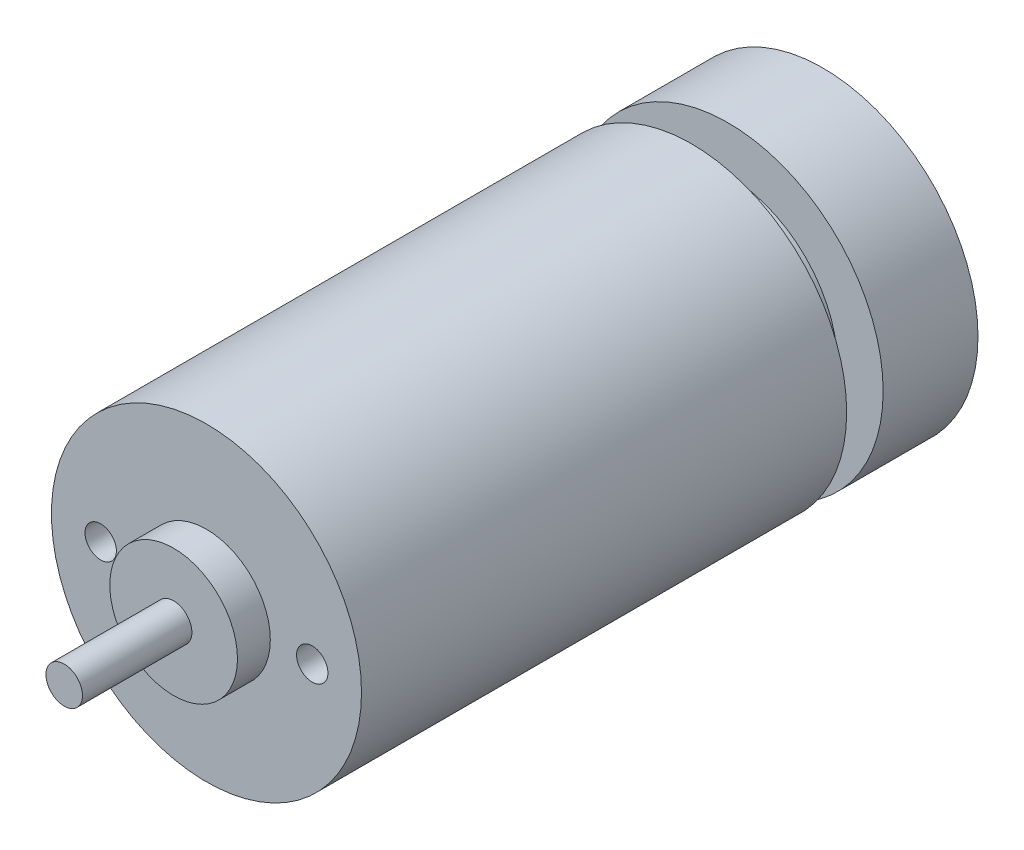
ISO-10303-21;
HEADER;
FILE_DESCRIPTION(('STEP AP214'),'2;1');
FILE_NAME('part.step','',(''),(''),'','','');
FILE_SCHEMA(('AUTOMOTIVE_DESIGN { 1 0 10303 214 1 1 1 1 }'));
ENDSEC;
DATA;
#1=APPLICATION_CONTEXT('core data for automotive mechanical design processes');
#2=APPLICATION_PROTOCOL_DEFINITION('international standard','automotive_design',2000,#1);
#3=PRODUCT_CONTEXT('',#1,'mechanical');
#4=PRODUCT('Part','Part','',(#3));
#5=PRODUCT_RELATED_PRODUCT_CATEGORY('part','',(#4));
#6=PRODUCT_DEFINITION_FORMATION('','',#4);
#7=PRODUCT_DEFINITION_CONTEXT('part definition',#1,'design');
#8=PRODUCT_DEFINITION('design','',#6,#7);
#9=PRODUCT_DEFINITION_SHAPE('','',#8);
#10=(LENGTH_UNIT() NAMED_UNIT(*) SI_UNIT(.MILLI.,.METRE.));
#11=(NAMED_UNIT(*) PLANE_ANGLE_UNIT() SI_UNIT($,.RADIAN.));
#12=(NAMED_UNIT(*) SI_UNIT($,.STERADIAN.) SOLID_ANGLE_UNIT());
#13=UNCERTAINTY_MEASURE_WITH_UNIT(LENGTH_MEASURE(1.E-05),#10,'distance_accuracy_value','');
#14=(GEOMETRIC_REPRESENTATION_CONTEXT(3) GLOBAL_UNCERTAINTY_ASSIGNED_CONTEXT((#13)) GLOBAL_UNIT_ASSIGNED_CONTEXT((#10,
#11,#12)) REPRESENTATION_CONTEXT('',''));
#15=CARTESIAN_POINT('',(0.,0.,0.));
#16=DIRECTION('',(0.,0.,1.));
#17=DIRECTION('',(1.,0.,0.));
#18=AXIS2_PLACEMENT_3D('',#15,#16,#17);
#19=CARTESIAN_POINT('',(0.,0.,66.5));
#20=DIRECTION('',(0.,0.,-1.));
#21=DIRECTION('',(-1.,0.,0.));
#22=AXIS2_PLACEMENT_3D('',#19,#20,#21);
#23=CYLINDRICAL_SURFACE('',#22,21.25);
#24=CARTESIAN_POINT('',(0.,0.,66.5));
#25=DIRECTION('',(0.,0.,1.));
#26=DIRECTION('',(1.,0.,0.));
#27=AXIS2_PLACEMENT_3D('',#24,#25,#26);
#28=CIRCLE('',#27,21.25);
#29=CARTESIAN_POINT('',(21.25,0.,66.5));
#30=VERTEX_POINT('',#29);
#31=EDGE_CURVE('E83',#30,#30,#28,.T.);
#32=ORIENTED_EDGE('',*,*,#31,.F.);
#33=EDGE_LOOP('',(#32));
#34=FACE_BOUND('',#33,.T.);
#35=CARTESIAN_POINT('',(0.,0.,0.));
#36=DIRECTION('',(0.,0.,1.));
#37=DIRECTION('',(1.,0.,0.));
#38=AXIS2_PLACEMENT_3D('',#35,#36,#37);
#39=CIRCLE('',#38,21.25);
#40=CARTESIAN_POINT('',(21.25,0.,0.));
#41=VERTEX_POINT('',#40);
#42=EDGE_CURVE('E40',#41,#41,#39,.T.);
#43=ORIENTED_EDGE('',*,*,#42,.T.);
#44=EDGE_LOOP('',(#43));
#45=FACE_BOUND('',#44,.T.);
#46=ADVANCED_FACE('F37',(#34,#45),#23,.T.);
#47=CARTESIAN_POINT('',(0.,0.,66.5));
#48=DIRECTION('',(0.,0.,1.));
#49=DIRECTION('',(1.,0.,0.));
#50=AXIS2_PLACEMENT_3D('',#47,#48,#49);
#51=PLANE('',#50);
#52=CARTESIAN_POINT('',(-14.5,0.,66.5));
#53=DIRECTION('',(0.,0.,1.));
#54=DIRECTION('',(1.,0.,0.));
#55=AXIS2_PLACEMENT_3D('',#52,#53,#54);
#56=CIRCLE('',#55,2.15);
#57=CARTESIAN_POINT('',(-12.35,0.,66.5));
#58=VERTEX_POINT('',#57);
#59=EDGE_CURVE('E62',#58,#58,#56,.T.);
#60=ORIENTED_EDGE('',*,*,#59,.F.);
#61=EDGE_LOOP('',(#60));
#62=FACE_BOUND('',#61,.T.);
#63=CARTESIAN_POINT('',(14.5,0.,66.5));
#64=DIRECTION('',(0.,0.,1.));
#65=DIRECTION('',(1.,0.,0.));
#66=AXIS2_PLACEMENT_3D('',#63,#64,#65);
#67=CIRCLE('',#66,2.15);
#68=CARTESIAN_POINT('',(16.65,0.,66.5));
#69=VERTEX_POINT('',#68);
#70=EDGE_CURVE('E70',#69,#69,#67,.T.);
#71=ORIENTED_EDGE('',*,*,#70,.F.);
#72=EDGE_LOOP('',(#71));
#73=FACE_BOUND('',#72,.T.);
#74=CARTESIAN_POINT('',(0.,0.,66.5));
#75=DIRECTION('',(0.,0.,1.));
#76=DIRECTION('',(1.,0.,0.));
#77=AXIS2_PLACEMENT_3D('',#74,#75,#76);
#78=CIRCLE('',#77,8.75);
#79=CARTESIAN_POINT('',(8.75,0.,66.5));
#80=VERTEX_POINT('',#79);
#81=EDGE_CURVE('E51',#80,#80,#78,.T.);
#82=ORIENTED_EDGE('',*,*,#81,.F.);
#83=EDGE_LOOP('',(#82));
#84=FACE_BOUND('',#83,.T.);
#85=ORIENTED_EDGE('',*,*,#31,.T.);
#86=EDGE_LOOP('',(#85));
#87=FACE_BOUND('',#86,.T.);
#88=ADVANCED_FACE('F96',(#62,#73,#84,#87),#51,.T.);
#89=CARTESIAN_POINT('',(0.,0.,0.));
#90=DIRECTION('',(0.,0.,1.));
#91=DIRECTION('',(1.,0.,0.));
#92=AXIS2_PLACEMENT_3D('',#89,#90,#91);
#93=PLANE('',#92);
#94=CARTESIAN_POINT('',(0.,0.,0.));
#95=DIRECTION('',(0.,0.,-1.));
#96=DIRECTION('',(-1.,0.,0.));
#97=AXIS2_PLACEMENT_3D('',#94,#95,#96);
#98=CIRCLE('',#97,15.);
#99=CARTESIAN_POINT('',(-15.,0.,0.));
#100=VERTEX_POINT('',#99);
#101=EDGE_CURVE('E10',#100,#100,#98,.T.);
#102=ORIENTED_EDGE('',*,*,#101,.F.);
#103=EDGE_LOOP('',(#102));
#104=FACE_BOUND('',#103,.T.);
#105=ORIENTED_EDGE('',*,*,#42,.F.);
#106=EDGE_LOOP('',(#105));
#107=FACE_BOUND('',#106,.T.);
#108=ADVANCED_FACE('F93',(#104,#107),#93,.F.);
#109=CARTESIAN_POINT('',(0.,0.,71.));
#110=DIRECTION('',(0.,0.,-1.));
#111=DIRECTION('',(-1.,0.,0.));
#112=AXIS2_PLACEMENT_3D('',#109,#110,#111);
#113=CYLINDRICAL_SURFACE('',#112,8.75);
#114=CARTESIAN_POINT('',(0.,0.,71.));
#115=DIRECTION('',(0.,0.,1.));
#116=DIRECTION('',(1.,0.,0.));
#117=AXIS2_PLACEMENT_3D('',#114,#115,#116);
#118=CIRCLE('',#117,8.75);
#119=CARTESIAN_POINT('',(8.75,0.,71.));
#120=VERTEX_POINT('',#119);
#121=EDGE_CURVE('E76',#120,#120,#118,.T.);
#122=ORIENTED_EDGE('',*,*,#121,.F.);
#123=EDGE_LOOP('',(#122));
#124=FACE_BOUND('',#123,.T.);
#125=ORIENTED_EDGE('',*,*,#81,.T.);
#126=EDGE_LOOP('',(#125));
#127=FACE_BOUND('',#126,.T.);
#128=ADVANCED_FACE('F95',(#124,#127),#113,.T.);
#129=CARTESIAN_POINT('',(0.,0.,71.));
#130=DIRECTION('',(0.,0.,1.));
#131=DIRECTION('',(1.,0.,0.));
#132=AXIS2_PLACEMENT_3D('',#129,#130,#131);
#133=PLANE('',#132);
#134=CARTESIAN_POINT('',(0.,0.,71.));
#135=DIRECTION('',(0.,0.,1.));
#136=DIRECTION('',(1.,0.,0.));
#137=AXIS2_PLACEMENT_3D('',#134,#135,#136);
#138=CIRCLE('',#137,2.5);
#139=CARTESIAN_POINT('',(2.5,0.,71.));
#140=VERTEX_POINT('',#139);
#141=EDGE_CURVE('E45',#140,#140,#138,.T.);
#142=ORIENTED_EDGE('',*,*,#141,.F.);
#143=EDGE_LOOP('',(#142));
#144=FACE_BOUND('',#143,.T.);
#145=ORIENTED_EDGE('',*,*,#121,.T.);
#146=EDGE_LOOP('',(#145));
#147=FACE_BOUND('',#146,.T.);
#148=ADVANCED_FACE('F102',(#144,#147),#133,.T.);
#149=CARTESIAN_POINT('',(0.,0.,86.));
#150=DIRECTION('',(0.,0.,-1.));
#151=DIRECTION('',(-1.,0.,0.));
#152=AXIS2_PLACEMENT_3D('',#149,#150,#151);
#153=CYLINDRICAL_SURFACE('',#152,2.5);
#154=CARTESIAN_POINT('',(0.,0.,86.));
#155=DIRECTION('',(0.,0.,1.));
#156=DIRECTION('',(1.,0.,0.));
#157=AXIS2_PLACEMENT_3D('',#154,#155,#156);
#158=CIRCLE('',#157,2.5);
#159=CARTESIAN_POINT('',(2.5,0.,86.));
#160=VERTEX_POINT('',#159);
#161=EDGE_CURVE('E61',#160,#160,#158,.T.);
#162=ORIENTED_EDGE('',*,*,#161,.F.);
#163=EDGE_LOOP('',(#162));
#164=FACE_BOUND('',#163,.T.);
#165=ORIENTED_EDGE('',*,*,#141,.T.);
#166=EDGE_LOOP('',(#165));
#167=FACE_BOUND('',#166,.T.);
#168=ADVANCED_FACE('F215',(#164,#167),#153,.T.);
#169=CARTESIAN_POINT('',(0.,0.,86.));
#170=DIRECTION('',(0.,0.,1.));
#171=DIRECTION('',(1.,0.,0.));
#172=AXIS2_PLACEMENT_3D('',#169,#170,#171);
#173=PLANE('',#172);
#174=ORIENTED_EDGE('',*,*,#161,.T.);
#175=EDGE_LOOP('',(#174));
#176=FACE_BOUND('',#175,.T.);
#177=ADVANCED_FACE('F123',(#176),#173,.T.);
#178=CARTESIAN_POINT('',(14.5,0.,56.5));
#179=DIRECTION('',(0.,0.,1.));
#180=DIRECTION('',(1.,0.,0.));
#181=AXIS2_PLACEMENT_3D('',#178,#179,#180);
#182=CYLINDRICAL_SURFACE('',#181,2.15);
#183=CARTESIAN_POINT('',(14.5,0.,56.5));
#184=DIRECTION('',(0.,0.,1.));
#185=DIRECTION('',(1.,0.,0.));
#186=AXIS2_PLACEMENT_3D('',#183,#184,#185);
#187=CIRCLE('',#186,2.15);
#188=CARTESIAN_POINT('',(16.65,0.,56.5));
#189=VERTEX_POINT('',#188);
#190=EDGE_CURVE('E66',#189,#189,#187,.T.);
#191=ORIENTED_EDGE('',*,*,#190,.F.);
#192=EDGE_LOOP('',(#191));
#193=FACE_BOUND('',#192,.T.);
#194=ORIENTED_EDGE('',*,*,#70,.T.);
#195=EDGE_LOOP('',(#194));
#196=FACE_BOUND('',#195,.T.);
#197=ADVANCED_FACE('F128',(#193,#196),#182,.F.);
#198=CARTESIAN_POINT('',(0.,0.,56.5));
#199=DIRECTION('',(0.,0.,1.));
#200=DIRECTION('',(1.,0.,0.));
#201=AXIS2_PLACEMENT_3D('',#198,#199,#200);
#202=PLANE('',#201);
#203=ORIENTED_EDGE('',*,*,#190,.T.);
#204=EDGE_LOOP('',(#203));
#205=FACE_BOUND('',#204,.T.);
#206=ADVANCED_FACE('F133',(#205),#202,.T.);
#207=CARTESIAN_POINT('',(-14.5,0.,56.5));
#208=DIRECTION('',(0.,0.,1.));
#209=DIRECTION('',(1.,0.,0.));
#210=AXIS2_PLACEMENT_3D('',#207,#208,#209);
#211=CYLINDRICAL_SURFACE('',#210,2.15);
#212=CARTESIAN_POINT('',(-14.5,0.,56.5));
#213=DIRECTION('',(0.,0.,1.));
#214=DIRECTION('',(1.,0.,0.));
#215=AXIS2_PLACEMENT_3D('',#212,#213,#214);
#216=CIRCLE('',#215,2.15);
#217=CARTESIAN_POINT('',(-12.35,0.,56.5));
#218=VERTEX_POINT('',#217);
#219=EDGE_CURVE('E57',#218,#218,#216,.T.);
#220=ORIENTED_EDGE('',*,*,#219,.F.);
#221=EDGE_LOOP('',(#220));
#222=FACE_BOUND('',#221,.T.);
#223=ORIENTED_EDGE('',*,*,#59,.T.);
#224=EDGE_LOOP('',(#223));
#225=FACE_BOUND('',#224,.T.);
#226=ADVANCED_FACE('F143',(#222,#225),#211,.F.);
#227=CARTESIAN_POINT('',(0.,0.,56.5));
#228=DIRECTION('',(0.,0.,1.));
#229=DIRECTION('',(1.,0.,0.));
#230=AXIS2_PLACEMENT_3D('',#227,#228,#229);
#231=PLANE('',#230);
#232=ORIENTED_EDGE('',*,*,#219,.T.);
#233=EDGE_LOOP('',(#232));
#234=FACE_BOUND('',#233,.T.);
#235=ADVANCED_FACE('F153',(#234),#231,.T.);
#236=CARTESIAN_POINT('',(0.,0.,-5.));
#237=DIRECTION('',(0.,0.,1.));
#238=DIRECTION('',(1.,0.,0.));
#239=AXIS2_PLACEMENT_3D('',#236,#237,#238);
#240=CYLINDRICAL_SURFACE('',#239,15.);
#241=CARTESIAN_POINT('',(0.,0.,-5.));
#242=DIRECTION('',(0.,0.,-1.));
#243=DIRECTION('',(-1.,0.,0.));
#244=AXIS2_PLACEMENT_3D('',#241,#242,#243);
#245=CIRCLE('',#244,15.);
#246=CARTESIAN_POINT('',(-15.,0.,-5.));
#247=VERTEX_POINT('',#246);
#248=EDGE_CURVE('E55',#247,#247,#245,.T.);
#249=ORIENTED_EDGE('',*,*,#248,.F.);
#250=EDGE_LOOP('',(#249));
#251=FACE_BOUND('',#250,.T.);
#252=ORIENTED_EDGE('',*,*,#101,.T.);
#253=EDGE_LOOP('',(#252));
#254=FACE_BOUND('',#253,.T.);
#255=ADVANCED_FACE('F162',(#251,#254),#240,.T.);
#256=CARTESIAN_POINT('',(0.,0.,-18.));
#257=DIRECTION('',(0.,0.,1.));
#258=DIRECTION('',(1.,0.,0.));
#259=AXIS2_PLACEMENT_3D('',#256,#257,#258);
#260=CYLINDRICAL_SURFACE('',#259,21.25);
#261=CARTESIAN_POINT('',(0.,0.,-18.));
#262=DIRECTION('',(0.,0.,-1.));
#263=DIRECTION('',(-1.,0.,0.));
#264=AXIS2_PLACEMENT_3D('',#261,#262,#263);
#265=CIRCLE('',#264,21.25);
#266=CARTESIAN_POINT('',(21.25,0.,-18.));
#267=VERTEX_POINT('',#266);
#268=EDGE_CURVE('E254',#267,#267,#265,.T.);
#269=CARTESIAN_POINT('',(0.,0.,-5.));
#270=DIRECTION('',(0.,0.,-1.));
#271=DIRECTION('',(-1.,0.,0.));
#272=AXIS2_PLACEMENT_3D('',#269,#270,#271);
#273=CIRCLE('',#272,21.25);
#274=CARTESIAN_POINT('',(21.25,0.,-5.));
#275=VERTEX_POINT('',#274);
#276=EDGE_CURVE('E251',#275,#275,#273,.T.);
#277=CARTESIAN_POINT('',(21.25,0.,-18.));
#278=CARTESIAN_POINT('',(21.25,0.,-17.8645833333333));
#279=CARTESIAN_POINT('',(21.25,0.,-17.7291666666667));
#280=CARTESIAN_POINT('',(21.25,0.,-17.4583333333333));
#281=CARTESIAN_POINT('',(21.25,0.,-17.3229166666667));
#282=CARTESIAN_POINT('',(21.25,0.,-17.0520833333333));
#283=CARTESIAN_POINT('',(21.25,0.,-16.9166666666667));
#284=CARTESIAN_POINT('',(21.25,0.,-16.6458333333333));
#285=CARTESIAN_POINT('',(21.25,0.,-16.5104166666667));
#286=CARTESIAN_POINT('',(21.25,0.,-16.2395833333333));
#287=CARTESIAN_POINT('',(21.25,0.,-16.1041666666667));
#288=CARTESIAN_POINT('',(21.25,0.,-15.8333333333333));
#289=CARTESIAN_POINT('',(21.25,0.,-15.6979166666667));
#290=CARTESIAN_POINT('',(21.25,0.,-15.4270833333333));
#291=CARTESIAN_POINT('',(21.25,0.,-15.2916666666667));
#292=CARTESIAN_POINT('',(21.25,0.,-15.0208333333333));
#293=CARTESIAN_POINT('',(21.25,0.,-14.8854166666667));
#294=CARTESIAN_POINT('',(21.25,0.,-14.6145833333333));
#295=CARTESIAN_POINT('',(21.25,0.,-14.4791666666667));
#296=CARTESIAN_POINT('',(21.25,0.,-14.2083333333333));
#297=CARTESIAN_POINT('',(21.25,0.,-14.0729166666667));
#298=CARTESIAN_POINT('',(21.25,0.,-13.8020833333333));
#299=CARTESIAN_POINT('',(21.25,0.,-13.6666666666667));
#300=CARTESIAN_POINT('',(21.25,0.,-13.3958333333333));
#301=CARTESIAN_POINT('',(21.25,0.,-13.2604166666667));
#302=CARTESIAN_POINT('',(21.25,0.,-12.9895833333333));
#303=CARTESIAN_POINT('',(21.25,0.,-12.8541666666667));
#304=CARTESIAN_POINT('',(21.25,0.,-12.5833333333333));
#305=CARTESIAN_POINT('',(21.25,0.,-12.4479166666667));
#306=CARTESIAN_POINT('',(21.25,0.,-12.1770833333333));
#307=CARTESIAN_POINT('',(21.25,0.,-12.0416666666667));
#308=CARTESIAN_POINT('',(21.25,0.,-11.7708333333333));
#309=CARTESIAN_POINT('',(21.25,0.,-11.6354166666667));
#310=CARTESIAN_POINT('',(21.25,0.,-11.3645833333333));
#311=CARTESIAN_POINT('',(21.25,0.,-11.2291666666667));
#312=CARTESIAN_POINT('',(21.25,0.,-10.9583333333333));
#313=CARTESIAN_POINT('',(21.25,0.,-10.8229166666667));
#314=CARTESIAN_POINT('',(21.25,0.,-10.5520833333333));
#315=CARTESIAN_POINT('',(21.25,0.,-10.4166666666667));
#316=CARTESIAN_POINT('',(21.25,0.,-10.1458333333333));
#317=CARTESIAN_POINT('',(21.25,0.,-10.0104166666667));
#318=CARTESIAN_POINT('',(21.25,0.,-9.73958333333333));
#319=CARTESIAN_POINT('',(21.25,0.,-9.60416666666667));
#320=CARTESIAN_POINT('',(21.25,0.,-9.33333333333333));
#321=CARTESIAN_POINT('',(21.25,0.,-9.19791666666667));
#322=CARTESIAN_POINT('',(21.25,0.,-8.92708333333333));
#323=CARTESIAN_POINT('',(21.25,0.,-8.79166666666667));
#324=CARTESIAN_POINT('',(21.25,0.,-8.52083333333333));
#325=CARTESIAN_POINT('',(21.25,0.,-8.38541666666667));
#326=CARTESIAN_POINT('',(21.25,0.,-8.11458333333333));
#327=CARTESIAN_POINT('',(21.25,0.,-7.97916666666667));
#328=CARTESIAN_POINT('',(21.25,0.,-7.70833333333333));
#329=CARTESIAN_POINT('',(21.25,0.,-7.57291666666667));
#330=CARTESIAN_POINT('',(21.25,0.,-7.30208333333333));
#331=CARTESIAN_POINT('',(21.25,0.,-7.16666666666667));
#332=CARTESIAN_POINT('',(21.25,0.,-6.89583333333333));
#333=CARTESIAN_POINT('',(21.25,0.,-6.76041666666667));
#334=CARTESIAN_POINT('',(21.25,0.,-6.48958333333333));
#335=CARTESIAN_POINT('',(21.25,0.,-6.35416666666667));
#336=CARTESIAN_POINT('',(21.25,0.,-6.08333333333333));
#337=CARTESIAN_POINT('',(21.25,0.,-5.94791666666667));
#338=CARTESIAN_POINT('',(21.25,0.,-5.67708333333333));
#339=CARTESIAN_POINT('',(21.25,0.,-5.54166666666667));
#340=CARTESIAN_POINT('',(21.25,0.,-5.27083333333333));
#341=CARTESIAN_POINT('',(21.25,0.,-5.13541666666667));
#342=CARTESIAN_POINT('',(21.25,0.,-5.));
#343=B_SPLINE_CURVE_WITH_KNOTS('',3,(#277,#278,#279,#280,#281,#282,#283,#284,#285,#286,#287,
#288,#289,#290,#291,#292,#293,#294,#295,#296,#297,#298,#299,#300,#301,#302,#303,#304,#305,#306,
#307,#308,#309,#310,#311,#312,#313,#314,#315,#316,#317,#318,#319,#320,#321,#322,#323,#324,#325,
#326,#327,#328,#329,#330,#331,#332,#333,#334,#335,#336,#337,#338,#339,#340,#341,#342),
.UNSPECIFIED.,.F.,.F.,(4,2,2,2,2,2,2,2,2,2,2,2,2,2,2,2,2,2,2,2,2,2,2,2,2,2,2,2,2,2,2,2,4),(0.,
0.406249999999997,0.812499999999997,1.21875,1.625,2.03125,2.4375,2.84375,3.25,3.65625,4.0625,
4.46875,4.875,5.28125,5.6875,6.09375,6.5,6.90625,7.3125,7.71875,8.125,8.53124999999999,8.9375,
9.34375,9.75,10.15625,10.5625,10.96875,11.375,11.78125,12.1875,12.59375,13.),.UNSPECIFIED.);
#344=EDGE_CURVE('BSEAM177',#267,#275,#343,.T.);
#345=ORIENTED_EDGE('',*,*,#268,.F.);
#346=ORIENTED_EDGE('',*,*,#276,.T.);
#347=ORIENTED_EDGE('',*,*,#344,.T.);
#348=ORIENTED_EDGE('',*,*,#344,.F.);
#349=EDGE_LOOP('',(#345,#347,#346,#348));
#350=FACE_BOUND('',#349,.T.);
#351=ADVANCED_FACE('F177',(#350),#260,.T.);
#352=CARTESIAN_POINT('',(0.,0.,-18.));
#353=DIRECTION('',(0.,0.,-1.));
#354=DIRECTION('',(-1.,0.,0.));
#355=AXIS2_PLACEMENT_3D('',#352,#353,#354);
#356=PLANE('',#355);
#357=ORIENTED_EDGE('',*,*,#268,.T.);
#358=EDGE_LOOP('',(#357));
#359=FACE_BOUND('',#358,.T.);
#360=ADVANCED_FACE('F187',(#359),#356,.T.);
#361=CARTESIAN_POINT('',(0.,0.,-5.));
#362=DIRECTION('',(0.,0.,-1.));
#363=DIRECTION('',(-1.,0.,0.));
#364=AXIS2_PLACEMENT_3D('',#361,#362,#363);
#365=PLANE('',#364);
#366=ORIENTED_EDGE('',*,*,#248,.T.);
#367=EDGE_LOOP('',(#366));
#368=FACE_BOUND('',#367,.T.);
#369=ORIENTED_EDGE('',*,*,#276,.F.);
#370=EDGE_LOOP('',(#369));
#371=FACE_BOUND('',#370,.T.);
#372=ADVANCED_FACE('F197',(#368,#371),#365,.F.);
#373=CLOSED_SHELL('',(#46,#88,#108,#128,#148,#168,#177,#197,#206,#226,#235,#255,#351,#360,#372));
#374=MANIFOLD_SOLID_BREP('B2',#373);
#375=ADVANCED_BREP_SHAPE_REPRESENTATION('',(#18,#374),#14);
#376=SHAPE_DEFINITION_REPRESENTATION(#9,#375);
ENDSEC;
END-ISO-10303-21;
